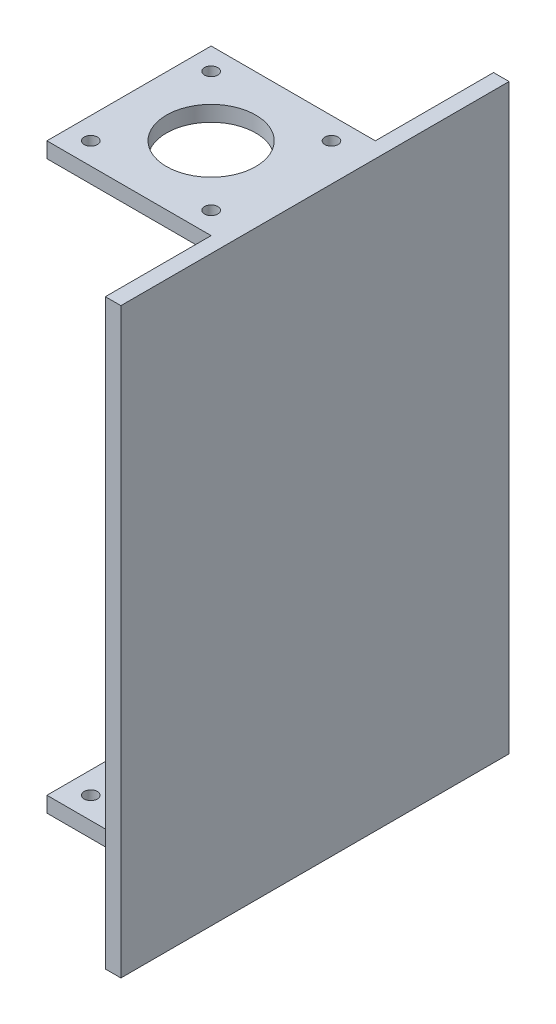
ISO-10303-21;
HEADER;
FILE_DESCRIPTION(('STEP AP214'),'2;1');
FILE_NAME('part.step','',(''),(''),'','','');
FILE_SCHEMA(('AUTOMOTIVE_DESIGN { 1 0 10303 214 1 1 1 1 }'));
ENDSEC;
DATA;
#1=APPLICATION_CONTEXT('core data for automotive mechanical design processes');
#2=APPLICATION_PROTOCOL_DEFINITION('international standard','automotive_design',2000,#1);
#3=PRODUCT_CONTEXT('',#1,'mechanical');
#4=PRODUCT('Part','Part','',(#3));
#5=PRODUCT_RELATED_PRODUCT_CATEGORY('part','',(#4));
#6=PRODUCT_DEFINITION_FORMATION('','',#4);
#7=PRODUCT_DEFINITION_CONTEXT('part definition',#1,'design');
#8=PRODUCT_DEFINITION('design','',#6,#7);
#9=PRODUCT_DEFINITION_SHAPE('','',#8);
#10=(LENGTH_UNIT() NAMED_UNIT(*) SI_UNIT(.MILLI.,.METRE.));
#11=(NAMED_UNIT(*) PLANE_ANGLE_UNIT() SI_UNIT($,.RADIAN.));
#12=(NAMED_UNIT(*) SI_UNIT($,.STERADIAN.) SOLID_ANGLE_UNIT());
#13=UNCERTAINTY_MEASURE_WITH_UNIT(LENGTH_MEASURE(1.E-05),#10,'distance_accuracy_value','');
#14=(GEOMETRIC_REPRESENTATION_CONTEXT(3) GLOBAL_UNCERTAINTY_ASSIGNED_CONTEXT((#13)) GLOBAL_UNIT_ASSIGNED_CONTEXT((#10,
#11,#12)) REPRESENTATION_CONTEXT('',''));
#15=CARTESIAN_POINT('',(0.,0.,0.));
#16=DIRECTION('',(0.,0.,1.));
#17=DIRECTION('',(1.,0.,0.));
#18=AXIS2_PLACEMENT_3D('',#15,#16,#17);
#19=CARTESIAN_POINT('',(21.15,0.,0.));
#20=DIRECTION('',(1.,0.,0.));
#21=DIRECTION('',(0.,0.,-1.));
#22=AXIS2_PLACEMENT_3D('',#19,#20,#21);
#23=PLANE('',#22);
#24=DIRECTION('',(0.,1.,0.));
#25=VECTOR('',#24,1.);
#26=CARTESIAN_POINT('',(21.15,-146.,21.15));
#27=LINE('',#26,#25);
#28=CARTESIAN_POINT('',(21.15,-146.,21.15));
#29=VERTEX_POINT('',#28);
#30=CARTESIAN_POINT('',(21.15,-142.,21.15));
#31=VERTEX_POINT('',#30);
#32=EDGE_CURVE('E143',#29,#31,#27,.T.);
#33=ORIENTED_EDGE('',*,*,#32,.F.);
#34=DIRECTION('',(0.,0.,-1.));
#35=VECTOR('',#34,1.);
#36=CARTESIAN_POINT('',(21.15,-146.,48.3941402757908));
#37=LINE('',#36,#35);
#38=CARTESIAN_POINT('',(21.15,-146.,48.3941402757908));
#39=VERTEX_POINT('',#38);
#40=EDGE_CURVE('E159',#39,#29,#37,.T.);
#41=ORIENTED_EDGE('',*,*,#40,.F.);
#42=DIRECTION('',(0.,-1.,0.));
#43=VECTOR('',#42,1.);
#44=CARTESIAN_POINT('',(21.15,4.,48.3941402757908));
#45=LINE('',#44,#43);
#46=CARTESIAN_POINT('',(21.15,4.,48.3941402757908));
#47=VERTEX_POINT('',#46);
#48=EDGE_CURVE('E163',#47,#39,#45,.T.);
#49=ORIENTED_EDGE('',*,*,#48,.F.);
#50=DIRECTION('',(0.,0.,1.));
#51=VECTOR('',#50,1.);
#52=CARTESIAN_POINT('',(21.15,4.,48.3941402757908));
#53=LINE('',#52,#51);
#54=CARTESIAN_POINT('',(21.15,4.,21.15));
#55=VERTEX_POINT('',#54);
#56=EDGE_CURVE('E171',#55,#47,#53,.T.);
#57=ORIENTED_EDGE('',*,*,#56,.F.);
#58=DIRECTION('',(0.,-1.,0.));
#59=VECTOR('',#58,1.);
#60=CARTESIAN_POINT('',(21.15,4.,21.15));
#61=LINE('',#60,#59);
#62=CARTESIAN_POINT('',(21.15,0.,21.15));
#63=VERTEX_POINT('',#62);
#64=EDGE_CURVE('E227',#55,#63,#61,.T.);
#65=ORIENTED_EDGE('',*,*,#64,.T.);
#66=DIRECTION('',(0.,0.,-1.));
#67=VECTOR('',#66,1.);
#68=CARTESIAN_POINT('',(21.15,0.,21.15));
#69=LINE('',#68,#67);
#70=CARTESIAN_POINT('',(21.15,0.,-21.15));
#71=VERTEX_POINT('',#70);
#72=EDGE_CURVE('E218',#63,#71,#69,.T.);
#73=ORIENTED_EDGE('',*,*,#72,.T.);
#74=DIRECTION('',(0.,-1.,0.));
#75=VECTOR('',#74,1.);
#76=CARTESIAN_POINT('',(21.15,4.,-21.15));
#77=LINE('',#76,#75);
#78=CARTESIAN_POINT('',(21.15,4.,-21.15));
#79=VERTEX_POINT('',#78);
#80=EDGE_CURVE('E11',#79,#71,#77,.T.);
#81=ORIENTED_EDGE('',*,*,#80,.F.);
#82=CARTESIAN_POINT('',(21.15,4.,-51.6058597242092));
#83=VERTEX_POINT('',#82);
#84=EDGE_CURVE('E176',#83,#79,#53,.T.);
#85=ORIENTED_EDGE('',*,*,#84,.F.);
#86=DIRECTION('',(0.,1.,0.));
#87=VECTOR('',#86,1.);
#88=CARTESIAN_POINT('',(21.15,4.,-51.6058597242092));
#89=LINE('',#88,#87);
#90=CARTESIAN_POINT('',(21.15,-146.,-51.6058597242092));
#91=VERTEX_POINT('',#90);
#92=EDGE_CURVE('E166',#91,#83,#89,.T.);
#93=ORIENTED_EDGE('',*,*,#92,.F.);
#94=CARTESIAN_POINT('',(21.15,-146.,-21.15));
#95=VERTEX_POINT('',#94);
#96=EDGE_CURVE('E169',#95,#91,#37,.T.);
#97=ORIENTED_EDGE('',*,*,#96,.F.);
#98=DIRECTION('',(0.,1.,0.));
#99=VECTOR('',#98,1.);
#100=CARTESIAN_POINT('',(21.15,-146.,-21.15));
#101=LINE('',#100,#99);
#102=CARTESIAN_POINT('',(21.15,-142.,-21.15));
#103=VERTEX_POINT('',#102);
#104=EDGE_CURVE('E473',#95,#103,#101,.T.);
#105=ORIENTED_EDGE('',*,*,#104,.T.);
#106=DIRECTION('',(0.,0.,-1.));
#107=VECTOR('',#106,1.);
#108=CARTESIAN_POINT('',(21.15,-142.,21.15));
#109=LINE('',#108,#107);
#110=EDGE_CURVE('E158',#31,#103,#109,.T.);
#111=ORIENTED_EDGE('',*,*,#110,.F.);
#112=EDGE_LOOP('',(#33,#41,#49,#57,#65,#73,#81,#85,#93,#97,#105,#111));
#113=FACE_BOUND('',#112,.T.);
#114=ADVANCED_FACE('F43',(#113),#23,.F.);
#115=CARTESIAN_POINT('',(0.,4.,0.));
#116=DIRECTION('',(0.,-1.,0.));
#117=DIRECTION('',(0.,0.,-1.));
#118=AXIS2_PLACEMENT_3D('',#115,#116,#117);
#119=PLANE('',#118);
#120=DIRECTION('',(1.,0.,0.));
#121=VECTOR('',#120,1.);
#122=CARTESIAN_POINT('',(-21.15,4.,21.15));
#123=LINE('',#122,#121);
#124=CARTESIAN_POINT('',(-21.15,4.,21.15));
#125=VERTEX_POINT('',#124);
#126=EDGE_CURVE('E66',#125,#55,#123,.T.);
#127=ORIENTED_EDGE('',*,*,#126,.T.);
#128=ORIENTED_EDGE('',*,*,#56,.T.);
#129=DIRECTION('',(-1.,0.,0.));
#130=VECTOR('',#129,1.);
#131=CARTESIAN_POINT('',(25.15,4.,48.3941402757908));
#132=LINE('',#131,#130);
#133=CARTESIAN_POINT('',(25.15,4.,48.3941402757908));
#134=VERTEX_POINT('',#133);
#135=EDGE_CURVE('E179',#134,#47,#132,.T.);
#136=ORIENTED_EDGE('',*,*,#135,.F.);
#137=DIRECTION('',(0.,0.,1.));
#138=VECTOR('',#137,1.);
#139=CARTESIAN_POINT('',(25.15,4.,48.3941402757908));
#140=LINE('',#139,#138);
#141=CARTESIAN_POINT('',(25.15,4.,-51.6058597242092));
#142=VERTEX_POINT('',#141);
#143=EDGE_CURVE('E183',#142,#134,#140,.T.);
#144=ORIENTED_EDGE('',*,*,#143,.F.);
#145=DIRECTION('',(-1.,0.,0.));
#146=VECTOR('',#145,1.);
#147=CARTESIAN_POINT('',(25.15,4.,-51.6058597242092));
#148=LINE('',#147,#146);
#149=EDGE_CURVE('E182',#142,#83,#148,.T.);
#150=ORIENTED_EDGE('',*,*,#149,.T.);
#151=ORIENTED_EDGE('',*,*,#84,.T.);
#152=DIRECTION('',(-1.,0.,0.));
#153=VECTOR('',#152,1.);
#154=CARTESIAN_POINT('',(-21.15,4.,-21.15));
#155=LINE('',#154,#153);
#156=CARTESIAN_POINT('',(-21.15,4.,-21.15));
#157=VERTEX_POINT('',#156);
#158=EDGE_CURVE('E95',#79,#157,#155,.T.);
#159=ORIENTED_EDGE('',*,*,#158,.T.);
#160=DIRECTION('',(0.,0.,1.));
#161=VECTOR('',#160,1.);
#162=CARTESIAN_POINT('',(-21.15,4.,21.15));
#163=LINE('',#162,#161);
#164=EDGE_CURVE('E225',#157,#125,#163,.T.);
#165=ORIENTED_EDGE('',*,*,#164,.T.);
#166=EDGE_LOOP('',(#127,#128,#136,#144,#150,#151,#159,#165));
#167=FACE_BOUND('',#166,.T.);
#168=CARTESIAN_POINT('',(-15.5,4.,-15.5));
#169=DIRECTION('',(0.,1.,0.));
#170=DIRECTION('',(0.,0.,1.));
#171=AXIS2_PLACEMENT_3D('',#168,#169,#170);
#172=CIRCLE('',#171,1.7);
#173=CARTESIAN_POINT('',(-15.5,4.,-13.8));
#174=VERTEX_POINT('',#173);
#175=EDGE_CURVE('E219',#174,#174,#172,.T.);
#176=ORIENTED_EDGE('',*,*,#175,.F.);
#177=EDGE_LOOP('',(#176));
#178=FACE_BOUND('',#177,.T.);
#179=CARTESIAN_POINT('',(15.5,4.,-15.5));
#180=DIRECTION('',(0.,1.,0.));
#181=DIRECTION('',(0.,0.,1.));
#182=AXIS2_PLACEMENT_3D('',#179,#180,#181);
#183=CIRCLE('',#182,1.7);
#184=CARTESIAN_POINT('',(15.5,4.,-13.8));
#185=VERTEX_POINT('',#184);
#186=EDGE_CURVE('E208',#185,#185,#183,.T.);
#187=ORIENTED_EDGE('',*,*,#186,.F.);
#188=EDGE_LOOP('',(#187));
#189=FACE_BOUND('',#188,.T.);
#190=CARTESIAN_POINT('',(15.5,4.,15.5));
#191=DIRECTION('',(0.,1.,0.));
#192=DIRECTION('',(0.,0.,1.));
#193=AXIS2_PLACEMENT_3D('',#190,#191,#192);
#194=CIRCLE('',#193,1.7);
#195=CARTESIAN_POINT('',(15.5,4.,17.2));
#196=VERTEX_POINT('',#195);
#197=EDGE_CURVE('E201',#196,#196,#194,.T.);
#198=ORIENTED_EDGE('',*,*,#197,.F.);
#199=EDGE_LOOP('',(#198));
#200=FACE_BOUND('',#199,.T.);
#201=CARTESIAN_POINT('',(-15.5,4.,15.5));
#202=DIRECTION('',(0.,1.,0.));
#203=DIRECTION('',(0.,0.,1.));
#204=AXIS2_PLACEMENT_3D('',#201,#202,#203);
#205=CIRCLE('',#204,1.7);
#206=CARTESIAN_POINT('',(-15.5,4.,17.2));
#207=VERTEX_POINT('',#206);
#208=EDGE_CURVE('E200',#207,#207,#205,.T.);
#209=ORIENTED_EDGE('',*,*,#208,.F.);
#210=EDGE_LOOP('',(#209));
#211=FACE_BOUND('',#210,.T.);
#212=CARTESIAN_POINT('',(0.,4.,0.));
#213=DIRECTION('',(0.,1.,0.));
#214=DIRECTION('',(0.,0.,1.));
#215=AXIS2_PLACEMENT_3D('',#212,#213,#214);
#216=CIRCLE('',#215,11.5);
#217=CARTESIAN_POINT('',(0.,4.,11.5));
#218=VERTEX_POINT('',#217);
#219=EDGE_CURVE('E195',#218,#218,#216,.T.);
#220=ORIENTED_EDGE('',*,*,#219,.F.);
#221=EDGE_LOOP('',(#220));
#222=FACE_BOUND('',#221,.T.);
#223=ADVANCED_FACE('F247',(#167,#178,#189,#200,#211,#222),#119,.F.);
#224=CARTESIAN_POINT('',(0.,0.,0.));
#225=DIRECTION('',(0.,-1.,0.));
#226=DIRECTION('',(0.,0.,-1.));
#227=AXIS2_PLACEMENT_3D('',#224,#225,#226);
#228=PLANE('',#227);
#229=CARTESIAN_POINT('',(-15.5,0.,15.5));
#230=DIRECTION('',(0.,1.,0.));
#231=DIRECTION('',(0.,0.,1.));
#232=AXIS2_PLACEMENT_3D('',#229,#230,#231);
#233=CIRCLE('',#232,1.7);
#234=CARTESIAN_POINT('',(-15.5,0.,17.2));
#235=VERTEX_POINT('',#234);
#236=EDGE_CURVE('E193',#235,#235,#233,.T.);
#237=ORIENTED_EDGE('',*,*,#236,.T.);
#238=EDGE_LOOP('',(#237));
#239=FACE_BOUND('',#238,.T.);
#240=CARTESIAN_POINT('',(15.5,0.,-15.5));
#241=DIRECTION('',(0.,1.,0.));
#242=DIRECTION('',(0.,0.,1.));
#243=AXIS2_PLACEMENT_3D('',#240,#241,#242);
#244=CIRCLE('',#243,1.7);
#245=CARTESIAN_POINT('',(15.5,0.,-13.8));
#246=VERTEX_POINT('',#245);
#247=EDGE_CURVE('E210',#246,#246,#244,.T.);
#248=ORIENTED_EDGE('',*,*,#247,.T.);
#249=EDGE_LOOP('',(#248));
#250=FACE_BOUND('',#249,.T.);
#251=ORIENTED_EDGE('',*,*,#72,.F.);
#252=DIRECTION('',(1.,0.,0.));
#253=VECTOR('',#252,1.);
#254=CARTESIAN_POINT('',(-21.15,0.,21.15));
#255=LINE('',#254,#253);
#256=CARTESIAN_POINT('',(-21.15,0.,21.15));
#257=VERTEX_POINT('',#256);
#258=EDGE_CURVE('E221',#257,#63,#255,.T.);
#259=ORIENTED_EDGE('',*,*,#258,.F.);
#260=DIRECTION('',(0.,0.,1.));
#261=VECTOR('',#260,1.);
#262=CARTESIAN_POINT('',(-21.15,0.,21.15));
#263=LINE('',#262,#261);
#264=CARTESIAN_POINT('',(-21.15,0.,-21.15));
#265=VERTEX_POINT('',#264);
#266=EDGE_CURVE('E89',#265,#257,#263,.T.);
#267=ORIENTED_EDGE('',*,*,#266,.F.);
#268=DIRECTION('',(-1.,0.,0.));
#269=VECTOR('',#268,1.);
#270=CARTESIAN_POINT('',(-21.15,0.,-21.15));
#271=LINE('',#270,#269);
#272=EDGE_CURVE('E229',#71,#265,#271,.T.);
#273=ORIENTED_EDGE('',*,*,#272,.F.);
#274=EDGE_LOOP('',(#251,#259,#267,#273));
#275=FACE_BOUND('',#274,.T.);
#276=CARTESIAN_POINT('',(-15.5,0.,-15.5));
#277=DIRECTION('',(0.,1.,0.));
#278=DIRECTION('',(0.,0.,1.));
#279=AXIS2_PLACEMENT_3D('',#276,#277,#278);
#280=CIRCLE('',#279,1.7);
#281=CARTESIAN_POINT('',(-15.5,0.,-13.8));
#282=VERTEX_POINT('',#281);
#283=EDGE_CURVE('E214',#282,#282,#280,.T.);
#284=ORIENTED_EDGE('',*,*,#283,.T.);
#285=EDGE_LOOP('',(#284));
#286=FACE_BOUND('',#285,.T.);
#287=CARTESIAN_POINT('',(15.5,0.,15.5));
#288=DIRECTION('',(0.,1.,0.));
#289=DIRECTION('',(0.,0.,1.));
#290=AXIS2_PLACEMENT_3D('',#287,#288,#289);
#291=CIRCLE('',#290,1.7);
#292=CARTESIAN_POINT('',(15.5,0.,17.2));
#293=VERTEX_POINT('',#292);
#294=EDGE_CURVE('E202',#293,#293,#291,.T.);
#295=ORIENTED_EDGE('',*,*,#294,.T.);
#296=EDGE_LOOP('',(#295));
#297=FACE_BOUND('',#296,.T.);
#298=CARTESIAN_POINT('',(0.,0.,0.));
#299=DIRECTION('',(0.,1.,0.));
#300=DIRECTION('',(0.,0.,1.));
#301=AXIS2_PLACEMENT_3D('',#298,#299,#300);
#302=CIRCLE('',#301,11.5);
#303=CARTESIAN_POINT('',(0.,0.,11.5));
#304=VERTEX_POINT('',#303);
#305=EDGE_CURVE('E192',#304,#304,#302,.T.);
#306=ORIENTED_EDGE('',*,*,#305,.T.);
#307=EDGE_LOOP('',(#306));
#308=FACE_BOUND('',#307,.T.);
#309=ADVANCED_FACE('F245',(#239,#250,#275,#286,#297,#308),#228,.T.);
#310=CARTESIAN_POINT('',(-21.15,4.,-21.15));
#311=DIRECTION('',(0.,0.,1.));
#312=DIRECTION('',(1.,0.,0.));
#313=AXIS2_PLACEMENT_3D('',#310,#311,#312);
#314=PLANE('',#313);
#315=ORIENTED_EDGE('',*,*,#272,.T.);
#316=DIRECTION('',(0.,-1.,0.));
#317=VECTOR('',#316,1.);
#318=CARTESIAN_POINT('',(-21.15,4.,-21.15));
#319=LINE('',#318,#317);
#320=EDGE_CURVE('E51',#157,#265,#319,.T.);
#321=ORIENTED_EDGE('',*,*,#320,.F.);
#322=ORIENTED_EDGE('',*,*,#158,.F.);
#323=ORIENTED_EDGE('',*,*,#80,.T.);
#324=EDGE_LOOP('',(#315,#321,#322,#323));
#325=FACE_BOUND('',#324,.T.);
#326=ADVANCED_FACE('F44',(#325),#314,.F.);
#327=CARTESIAN_POINT('',(-21.15,4.,21.15));
#328=DIRECTION('',(1.,0.,0.));
#329=DIRECTION('',(0.,0.,-1.));
#330=AXIS2_PLACEMENT_3D('',#327,#328,#329);
#331=PLANE('',#330);
#332=ORIENTED_EDGE('',*,*,#266,.T.);
#333=DIRECTION('',(0.,-1.,0.));
#334=VECTOR('',#333,1.);
#335=CARTESIAN_POINT('',(-21.15,4.,21.15));
#336=LINE('',#335,#334);
#337=EDGE_CURVE('E240',#125,#257,#336,.T.);
#338=ORIENTED_EDGE('',*,*,#337,.F.);
#339=ORIENTED_EDGE('',*,*,#164,.F.);
#340=ORIENTED_EDGE('',*,*,#320,.T.);
#341=EDGE_LOOP('',(#332,#338,#339,#340));
#342=FACE_BOUND('',#341,.T.);
#343=ADVANCED_FACE('F237',(#342),#331,.F.);
#344=CARTESIAN_POINT('',(-21.15,4.,21.15));
#345=DIRECTION('',(0.,0.,-1.));
#346=DIRECTION('',(-1.,0.,0.));
#347=AXIS2_PLACEMENT_3D('',#344,#345,#346);
#348=PLANE('',#347);
#349=ORIENTED_EDGE('',*,*,#258,.T.);
#350=ORIENTED_EDGE('',*,*,#64,.F.);
#351=ORIENTED_EDGE('',*,*,#126,.F.);
#352=ORIENTED_EDGE('',*,*,#337,.T.);
#353=EDGE_LOOP('',(#349,#350,#351,#352));
#354=FACE_BOUND('',#353,.T.);
#355=ADVANCED_FACE('F244',(#354),#348,.F.);
#356=CARTESIAN_POINT('',(-15.5,4.,-15.5));
#357=DIRECTION('',(0.,-1.,0.));
#358=DIRECTION('',(0.,0.,-1.));
#359=AXIS2_PLACEMENT_3D('',#356,#357,#358);
#360=CYLINDRICAL_SURFACE('',#359,1.7);
#361=ORIENTED_EDGE('',*,*,#175,.T.);
#362=EDGE_LOOP('',(#361));
#363=FACE_BOUND('',#362,.T.);
#364=ORIENTED_EDGE('',*,*,#283,.F.);
#365=EDGE_LOOP('',(#364));
#366=FACE_BOUND('',#365,.T.);
#367=ADVANCED_FACE('F307',(#363,#366),#360,.F.);
#368=CARTESIAN_POINT('',(15.5,4.,-15.5));
#369=DIRECTION('',(0.,-1.,0.));
#370=DIRECTION('',(0.,0.,-1.));
#371=AXIS2_PLACEMENT_3D('',#368,#369,#370);
#372=CYLINDRICAL_SURFACE('',#371,1.7);
#373=ORIENTED_EDGE('',*,*,#186,.T.);
#374=EDGE_LOOP('',(#373));
#375=FACE_BOUND('',#374,.T.);
#376=ORIENTED_EDGE('',*,*,#247,.F.);
#377=EDGE_LOOP('',(#376));
#378=FACE_BOUND('',#377,.T.);
#379=ADVANCED_FACE('F304',(#375,#378),#372,.F.);
#380=CARTESIAN_POINT('',(15.5,4.,15.5));
#381=DIRECTION('',(0.,-1.,0.));
#382=DIRECTION('',(0.,0.,-1.));
#383=AXIS2_PLACEMENT_3D('',#380,#381,#382);
#384=CYLINDRICAL_SURFACE('',#383,1.7);
#385=ORIENTED_EDGE('',*,*,#197,.T.);
#386=EDGE_LOOP('',(#385));
#387=FACE_BOUND('',#386,.T.);
#388=ORIENTED_EDGE('',*,*,#294,.F.);
#389=EDGE_LOOP('',(#388));
#390=FACE_BOUND('',#389,.T.);
#391=ADVANCED_FACE('F301',(#387,#390),#384,.F.);
#392=CARTESIAN_POINT('',(-15.5,4.,15.5));
#393=DIRECTION('',(0.,-1.,0.));
#394=DIRECTION('',(0.,0.,-1.));
#395=AXIS2_PLACEMENT_3D('',#392,#393,#394);
#396=CYLINDRICAL_SURFACE('',#395,1.7);
#397=ORIENTED_EDGE('',*,*,#208,.T.);
#398=EDGE_LOOP('',(#397));
#399=FACE_BOUND('',#398,.T.);
#400=ORIENTED_EDGE('',*,*,#236,.F.);
#401=EDGE_LOOP('',(#400));
#402=FACE_BOUND('',#401,.T.);
#403=ADVANCED_FACE('F300',(#399,#402),#396,.F.);
#404=CARTESIAN_POINT('',(0.,4.,0.));
#405=DIRECTION('',(0.,-1.,0.));
#406=DIRECTION('',(0.,0.,-1.));
#407=AXIS2_PLACEMENT_3D('',#404,#405,#406);
#408=CYLINDRICAL_SURFACE('',#407,11.5);
#409=ORIENTED_EDGE('',*,*,#219,.T.);
#410=EDGE_LOOP('',(#409));
#411=FACE_BOUND('',#410,.T.);
#412=ORIENTED_EDGE('',*,*,#305,.F.);
#413=EDGE_LOOP('',(#412));
#414=FACE_BOUND('',#413,.T.);
#415=ADVANCED_FACE('F295',(#411,#414),#408,.F.);
#416=CARTESIAN_POINT('',(25.15,4.,48.3941402757908));
#417=DIRECTION('',(0.,0.,-1.));
#418=DIRECTION('',(0.,1.,0.));
#419=AXIS2_PLACEMENT_3D('',#416,#417,#418);
#420=PLANE('',#419);
#421=ORIENTED_EDGE('',*,*,#48,.T.);
#422=DIRECTION('',(-1.,0.,0.));
#423=VECTOR('',#422,1.);
#424=CARTESIAN_POINT('',(25.15,-146.,48.3941402757908));
#425=LINE('',#424,#423);
#426=CARTESIAN_POINT('',(25.15,-146.,48.3941402757908));
#427=VERTEX_POINT('',#426);
#428=EDGE_CURVE('E168',#427,#39,#425,.T.);
#429=ORIENTED_EDGE('',*,*,#428,.F.);
#430=DIRECTION('',(0.,-1.,0.));
#431=VECTOR('',#430,1.);
#432=CARTESIAN_POINT('',(25.15,4.,48.3941402757908));
#433=LINE('',#432,#431);
#434=EDGE_CURVE('E177',#134,#427,#433,.T.);
#435=ORIENTED_EDGE('',*,*,#434,.F.);
#436=ORIENTED_EDGE('',*,*,#135,.T.);
#437=EDGE_LOOP('',(#421,#429,#435,#436));
#438=FACE_BOUND('',#437,.T.);
#439=ADVANCED_FACE('F254',(#438),#420,.F.);
#440=CARTESIAN_POINT('',(25.15,-146.,48.3941402757908));
#441=DIRECTION('',(0.,1.,0.));
#442=DIRECTION('',(0.,0.,1.));
#443=AXIS2_PLACEMENT_3D('',#440,#441,#442);
#444=PLANE('',#443);
#445=ORIENTED_EDGE('',*,*,#40,.T.);
#446=DIRECTION('',(1.,0.,0.));
#447=VECTOR('',#446,1.);
#448=CARTESIAN_POINT('',(-21.15,-146.,21.15));
#449=LINE('',#448,#447);
#450=CARTESIAN_POINT('',(-21.15,-146.,21.15));
#451=VERTEX_POINT('',#450);
#452=EDGE_CURVE('E145',#451,#29,#449,.T.);
#453=ORIENTED_EDGE('',*,*,#452,.F.);
#454=DIRECTION('',(0.,0.,1.));
#455=VECTOR('',#454,1.);
#456=CARTESIAN_POINT('',(-21.15,-146.,21.15));
#457=LINE('',#456,#455);
#458=CARTESIAN_POINT('',(-21.15,-146.,-21.15));
#459=VERTEX_POINT('',#458);
#460=EDGE_CURVE('E151',#459,#451,#457,.T.);
#461=ORIENTED_EDGE('',*,*,#460,.F.);
#462=DIRECTION('',(-1.,0.,0.));
#463=VECTOR('',#462,1.);
#464=CARTESIAN_POINT('',(-21.15,-146.,-21.15));
#465=LINE('',#464,#463);
#466=EDGE_CURVE('E475',#95,#459,#465,.T.);
#467=ORIENTED_EDGE('',*,*,#466,.F.);
#468=ORIENTED_EDGE('',*,*,#96,.T.);
#469=DIRECTION('',(-1.,0.,0.));
#470=VECTOR('',#469,1.);
#471=CARTESIAN_POINT('',(25.15,-146.,-51.6058597242092));
#472=LINE('',#471,#470);
#473=CARTESIAN_POINT('',(25.15,-146.,-51.6058597242092));
#474=VERTEX_POINT('',#473);
#475=EDGE_CURVE('E190',#474,#91,#472,.T.);
#476=ORIENTED_EDGE('',*,*,#475,.F.);
#477=DIRECTION('',(0.,0.,-1.));
#478=VECTOR('',#477,1.);
#479=CARTESIAN_POINT('',(25.15,-146.,48.3941402757908));
#480=LINE('',#479,#478);
#481=EDGE_CURVE('E257',#427,#474,#480,.T.);
#482=ORIENTED_EDGE('',*,*,#481,.F.);
#483=ORIENTED_EDGE('',*,*,#428,.T.);
#484=EDGE_LOOP('',(#445,#453,#461,#467,#468,#476,#482,#483));
#485=FACE_BOUND('',#484,.T.);
#486=CARTESIAN_POINT('',(0.,-146.,0.));
#487=DIRECTION('',(0.,1.,0.));
#488=DIRECTION('',(0.,0.,1.));
#489=AXIS2_PLACEMENT_3D('',#486,#487,#488);
#490=CIRCLE('',#489,11.5);
#491=CARTESIAN_POINT('',(0.,-146.,11.5));
#492=VERTEX_POINT('',#491);
#493=EDGE_CURVE('E439',#492,#492,#490,.T.);
#494=ORIENTED_EDGE('',*,*,#493,.T.);
#495=EDGE_LOOP('',(#494));
#496=FACE_BOUND('',#495,.T.);
#497=CARTESIAN_POINT('',(-15.5,-146.,15.5));
#498=DIRECTION('',(0.,1.,0.));
#499=DIRECTION('',(0.,0.,1.));
#500=AXIS2_PLACEMENT_3D('',#497,#498,#499);
#501=CIRCLE('',#500,1.7);
#502=CARTESIAN_POINT('',(-15.5,-146.,17.2));
#503=VERTEX_POINT('',#502);
#504=EDGE_CURVE('E449',#503,#503,#501,.T.);
#505=ORIENTED_EDGE('',*,*,#504,.T.);
#506=EDGE_LOOP('',(#505));
#507=FACE_BOUND('',#506,.T.);
#508=CARTESIAN_POINT('',(15.5,-146.,15.5));
#509=DIRECTION('',(0.,1.,0.));
#510=DIRECTION('',(0.,0.,1.));
#511=AXIS2_PLACEMENT_3D('',#508,#509,#510);
#512=CIRCLE('',#511,1.7);
#513=CARTESIAN_POINT('',(15.5,-146.,17.2));
#514=VERTEX_POINT('',#513);
#515=EDGE_CURVE('E451',#514,#514,#512,.T.);
#516=ORIENTED_EDGE('',*,*,#515,.T.);
#517=EDGE_LOOP('',(#516));
#518=FACE_BOUND('',#517,.T.);
#519=CARTESIAN_POINT('',(15.5,-146.,-15.5));
#520=DIRECTION('',(0.,1.,0.));
#521=DIRECTION('',(0.,0.,1.));
#522=AXIS2_PLACEMENT_3D('',#519,#520,#521);
#523=CIRCLE('',#522,1.7);
#524=CARTESIAN_POINT('',(15.5,-146.,-13.8));
#525=VERTEX_POINT('',#524);
#526=EDGE_CURVE('E457',#525,#525,#523,.T.);
#527=ORIENTED_EDGE('',*,*,#526,.T.);
#528=EDGE_LOOP('',(#527));
#529=FACE_BOUND('',#528,.T.);
#530=CARTESIAN_POINT('',(-15.5,-146.,-15.5));
#531=DIRECTION('',(0.,1.,0.));
#532=DIRECTION('',(0.,0.,1.));
#533=AXIS2_PLACEMENT_3D('',#530,#531,#532);
#534=CIRCLE('',#533,1.7);
#535=CARTESIAN_POINT('',(-15.5,-146.,-13.8));
#536=VERTEX_POINT('',#535);
#537=EDGE_CURVE('E467',#536,#536,#534,.T.);
#538=ORIENTED_EDGE('',*,*,#537,.T.);
#539=EDGE_LOOP('',(#538));
#540=FACE_BOUND('',#539,.T.);
#541=ADVANCED_FACE('F161',(#485,#496,#507,#518,#529,#540),#444,.F.);
#542=CARTESIAN_POINT('',(25.15,4.,-51.6058597242092));
#543=DIRECTION('',(0.,0.,1.));
#544=DIRECTION('',(0.,-1.,0.));
#545=AXIS2_PLACEMENT_3D('',#542,#543,#544);
#546=PLANE('',#545);
#547=ORIENTED_EDGE('',*,*,#92,.T.);
#548=ORIENTED_EDGE('',*,*,#149,.F.);
#549=DIRECTION('',(0.,1.,0.));
#550=VECTOR('',#549,1.);
#551=CARTESIAN_POINT('',(25.15,4.,-51.6058597242092));
#552=LINE('',#551,#550);
#553=EDGE_CURVE('E259',#474,#142,#552,.T.);
#554=ORIENTED_EDGE('',*,*,#553,.F.);
#555=ORIENTED_EDGE('',*,*,#475,.T.);
#556=EDGE_LOOP('',(#547,#548,#554,#555));
#557=FACE_BOUND('',#556,.T.);
#558=ADVANCED_FACE('F290',(#557),#546,.F.);
#559=CARTESIAN_POINT('',(25.15,0.,0.));
#560=DIRECTION('',(1.,0.,0.));
#561=DIRECTION('',(0.,0.,-1.));
#562=AXIS2_PLACEMENT_3D('',#559,#560,#561);
#563=PLANE('',#562);
#564=ORIENTED_EDGE('',*,*,#434,.T.);
#565=ORIENTED_EDGE('',*,*,#481,.T.);
#566=ORIENTED_EDGE('',*,*,#553,.T.);
#567=ORIENTED_EDGE('',*,*,#143,.T.);
#568=EDGE_LOOP('',(#564,#565,#566,#567));
#569=FACE_BOUND('',#568,.T.);
#570=ADVANCED_FACE('F261',(#569),#563,.T.);
#571=CARTESIAN_POINT('',(-21.15,-146.,21.15));
#572=DIRECTION('',(0.,0.,1.));
#573=DIRECTION('',(1.,0.,0.));
#574=AXIS2_PLACEMENT_3D('',#571,#572,#573);
#575=PLANE('',#574);
#576=DIRECTION('',(1.,0.,0.));
#577=VECTOR('',#576,1.);
#578=CARTESIAN_POINT('',(-21.15,-142.,21.15));
#579=LINE('',#578,#577);
#580=CARTESIAN_POINT('',(-21.15,-142.,21.15));
#581=VERTEX_POINT('',#580);
#582=EDGE_CURVE('E59',#581,#31,#579,.T.);
#583=ORIENTED_EDGE('',*,*,#582,.F.);
#584=DIRECTION('',(0.,1.,0.));
#585=VECTOR('',#584,1.);
#586=CARTESIAN_POINT('',(-21.15,-146.,21.15));
#587=LINE('',#586,#585);
#588=EDGE_CURVE('E150',#451,#581,#587,.T.);
#589=ORIENTED_EDGE('',*,*,#588,.F.);
#590=ORIENTED_EDGE('',*,*,#452,.T.);
#591=ORIENTED_EDGE('',*,*,#32,.T.);
#592=EDGE_LOOP('',(#583,#589,#590,#591));
#593=FACE_BOUND('',#592,.T.);
#594=ADVANCED_FACE('F144',(#593),#575,.T.);
#595=CARTESIAN_POINT('',(-21.15,-146.,21.15));
#596=DIRECTION('',(-1.,0.,0.));
#597=DIRECTION('',(0.,0.,1.));
#598=AXIS2_PLACEMENT_3D('',#595,#596,#597);
#599=PLANE('',#598);
#600=DIRECTION('',(0.,0.,1.));
#601=VECTOR('',#600,1.);
#602=CARTESIAN_POINT('',(-21.15,-142.,21.15));
#603=LINE('',#602,#601);
#604=CARTESIAN_POINT('',(-21.15,-142.,-21.15));
#605=VERTEX_POINT('',#604);
#606=EDGE_CURVE('E480',#605,#581,#603,.T.);
#607=ORIENTED_EDGE('',*,*,#606,.F.);
#608=DIRECTION('',(0.,1.,0.));
#609=VECTOR('',#608,1.);
#610=CARTESIAN_POINT('',(-21.15,-146.,-21.15));
#611=LINE('',#610,#609);
#612=EDGE_CURVE('E485',#459,#605,#611,.T.);
#613=ORIENTED_EDGE('',*,*,#612,.F.);
#614=ORIENTED_EDGE('',*,*,#460,.T.);
#615=ORIENTED_EDGE('',*,*,#588,.T.);
#616=EDGE_LOOP('',(#607,#613,#614,#615));
#617=FACE_BOUND('',#616,.T.);
#618=ADVANCED_FACE('F358',(#617),#599,.T.);
#619=CARTESIAN_POINT('',(-21.15,-146.,-21.15));
#620=DIRECTION('',(0.,0.,-1.));
#621=DIRECTION('',(-1.,0.,0.));
#622=AXIS2_PLACEMENT_3D('',#619,#620,#621);
#623=PLANE('',#622);
#624=DIRECTION('',(-1.,0.,0.));
#625=VECTOR('',#624,1.);
#626=CARTESIAN_POINT('',(-21.15,-142.,-21.15));
#627=LINE('',#626,#625);
#628=EDGE_CURVE('E155',#103,#605,#627,.T.);
#629=ORIENTED_EDGE('',*,*,#628,.F.);
#630=ORIENTED_EDGE('',*,*,#104,.F.);
#631=ORIENTED_EDGE('',*,*,#466,.T.);
#632=ORIENTED_EDGE('',*,*,#612,.T.);
#633=EDGE_LOOP('',(#629,#630,#631,#632));
#634=FACE_BOUND('',#633,.T.);
#635=ADVANCED_FACE('F364',(#634),#623,.T.);
#636=CARTESIAN_POINT('',(0.,-142.,0.));
#637=DIRECTION('',(0.,1.,0.));
#638=DIRECTION('',(0.,0.,-1.));
#639=AXIS2_PLACEMENT_3D('',#636,#637,#638);
#640=PLANE('',#639);
#641=CARTESIAN_POINT('',(0.,-142.,0.));
#642=DIRECTION('',(0.,1.,0.));
#643=DIRECTION('',(0.,0.,1.));
#644=AXIS2_PLACEMENT_3D('',#641,#642,#643);
#645=CIRCLE('',#644,11.5);
#646=CARTESIAN_POINT('',(0.,-142.,11.5));
#647=VERTEX_POINT('',#646);
#648=EDGE_CURVE('E442',#647,#647,#645,.T.);
#649=ORIENTED_EDGE('',*,*,#648,.F.);
#650=EDGE_LOOP('',(#649));
#651=FACE_BOUND('',#650,.T.);
#652=CARTESIAN_POINT('',(-15.5,-142.,15.5));
#653=DIRECTION('',(0.,1.,0.));
#654=DIRECTION('',(0.,0.,1.));
#655=AXIS2_PLACEMENT_3D('',#652,#653,#654);
#656=CIRCLE('',#655,1.7);
#657=CARTESIAN_POINT('',(-15.5,-142.,17.2));
#658=VERTEX_POINT('',#657);
#659=EDGE_CURVE('E444',#658,#658,#656,.T.);
#660=ORIENTED_EDGE('',*,*,#659,.F.);
#661=EDGE_LOOP('',(#660));
#662=FACE_BOUND('',#661,.T.);
#663=CARTESIAN_POINT('',(15.5,-142.,15.5));
#664=DIRECTION('',(0.,1.,0.));
#665=DIRECTION('',(0.,0.,1.));
#666=AXIS2_PLACEMENT_3D('',#663,#664,#665);
#667=CIRCLE('',#666,1.7);
#668=CARTESIAN_POINT('',(15.5,-142.,17.2));
#669=VERTEX_POINT('',#668);
#670=EDGE_CURVE('E452',#669,#669,#667,.T.);
#671=ORIENTED_EDGE('',*,*,#670,.F.);
#672=EDGE_LOOP('',(#671));
#673=FACE_BOUND('',#672,.T.);
#674=CARTESIAN_POINT('',(15.5,-142.,-15.5));
#675=DIRECTION('',(0.,1.,0.));
#676=DIRECTION('',(0.,0.,1.));
#677=AXIS2_PLACEMENT_3D('',#674,#675,#676);
#678=CIRCLE('',#677,1.7);
#679=CARTESIAN_POINT('',(15.5,-142.,-13.8));
#680=VERTEX_POINT('',#679);
#681=EDGE_CURVE('E456',#680,#680,#678,.T.);
#682=ORIENTED_EDGE('',*,*,#681,.F.);
#683=EDGE_LOOP('',(#682));
#684=FACE_BOUND('',#683,.T.);
#685=CARTESIAN_POINT('',(-15.5,-142.,-15.5));
#686=DIRECTION('',(0.,1.,0.));
#687=DIRECTION('',(0.,0.,1.));
#688=AXIS2_PLACEMENT_3D('',#685,#686,#687);
#689=CIRCLE('',#688,1.7);
#690=CARTESIAN_POINT('',(-15.5,-142.,-13.8));
#691=VERTEX_POINT('',#690);
#692=EDGE_CURVE('E465',#691,#691,#689,.T.);
#693=ORIENTED_EDGE('',*,*,#692,.F.);
#694=EDGE_LOOP('',(#693));
#695=FACE_BOUND('',#694,.T.);
#696=ORIENTED_EDGE('',*,*,#110,.T.);
#697=ORIENTED_EDGE('',*,*,#628,.T.);
#698=ORIENTED_EDGE('',*,*,#606,.T.);
#699=ORIENTED_EDGE('',*,*,#582,.T.);
#700=EDGE_LOOP('',(#696,#697,#698,#699));
#701=FACE_BOUND('',#700,.T.);
#702=ADVANCED_FACE('F372',(#651,#662,#673,#684,#695,#701),#640,.T.);
#703=CARTESIAN_POINT('',(-15.5,-146.,-15.5));
#704=DIRECTION('',(0.,1.,0.));
#705=DIRECTION('',(0.,0.,1.));
#706=AXIS2_PLACEMENT_3D('',#703,#704,#705);
#707=CYLINDRICAL_SURFACE('',#706,1.7);
#708=ORIENTED_EDGE('',*,*,#537,.F.);
#709=EDGE_LOOP('',(#708));
#710=FACE_BOUND('',#709,.T.);
#711=ORIENTED_EDGE('',*,*,#692,.T.);
#712=EDGE_LOOP('',(#711));
#713=FACE_BOUND('',#712,.T.);
#714=ADVANCED_FACE('F381',(#710,#713),#707,.F.);
#715=CARTESIAN_POINT('',(15.5,-146.,-15.5));
#716=DIRECTION('',(0.,1.,0.));
#717=DIRECTION('',(0.,0.,1.));
#718=AXIS2_PLACEMENT_3D('',#715,#716,#717);
#719=CYLINDRICAL_SURFACE('',#718,1.7);
#720=ORIENTED_EDGE('',*,*,#526,.F.);
#721=EDGE_LOOP('',(#720));
#722=FACE_BOUND('',#721,.T.);
#723=ORIENTED_EDGE('',*,*,#681,.T.);
#724=EDGE_LOOP('',(#723));
#725=FACE_BOUND('',#724,.T.);
#726=ADVANCED_FACE('F393',(#722,#725),#719,.F.);
#727=CARTESIAN_POINT('',(15.5,-146.,15.5));
#728=DIRECTION('',(0.,1.,0.));
#729=DIRECTION('',(0.,0.,1.));
#730=AXIS2_PLACEMENT_3D('',#727,#728,#729);
#731=CYLINDRICAL_SURFACE('',#730,1.7);
#732=ORIENTED_EDGE('',*,*,#515,.F.);
#733=EDGE_LOOP('',(#732));
#734=FACE_BOUND('',#733,.T.);
#735=ORIENTED_EDGE('',*,*,#670,.T.);
#736=EDGE_LOOP('',(#735));
#737=FACE_BOUND('',#736,.T.);
#738=ADVANCED_FACE('F404',(#734,#737),#731,.F.);
#739=CARTESIAN_POINT('',(-15.5,-146.,15.5));
#740=DIRECTION('',(0.,1.,0.));
#741=DIRECTION('',(0.,0.,1.));
#742=AXIS2_PLACEMENT_3D('',#739,#740,#741);
#743=CYLINDRICAL_SURFACE('',#742,1.7);
#744=ORIENTED_EDGE('',*,*,#504,.F.);
#745=EDGE_LOOP('',(#744));
#746=FACE_BOUND('',#745,.T.);
#747=ORIENTED_EDGE('',*,*,#659,.T.);
#748=EDGE_LOOP('',(#747));
#749=FACE_BOUND('',#748,.T.);
#750=ADVANCED_FACE('F413',(#746,#749),#743,.F.);
#751=CARTESIAN_POINT('',(0.,-146.,0.));
#752=DIRECTION('',(0.,1.,0.));
#753=DIRECTION('',(0.,0.,1.));
#754=AXIS2_PLACEMENT_3D('',#751,#752,#753);
#755=CYLINDRICAL_SURFACE('',#754,11.5);
#756=ORIENTED_EDGE('',*,*,#493,.F.);
#757=EDGE_LOOP('',(#756));
#758=FACE_BOUND('',#757,.T.);
#759=ORIENTED_EDGE('',*,*,#648,.T.);
#760=EDGE_LOOP('',(#759));
#761=FACE_BOUND('',#760,.T.);
#762=ADVANCED_FACE('F425',(#758,#761),#755,.F.);
#763=CLOSED_SHELL('',(#114,#223,#309,#326,#343,#355,#367,#379,#391,#403,#415,#439,#541,#558,
#570,#594,#618,#635,#702,#714,#726,#738,#750,#762));
#764=MANIFOLD_SOLID_BREP('B2',#763);
#765=ADVANCED_BREP_SHAPE_REPRESENTATION('',(#18,#764),#14);
#766=SHAPE_DEFINITION_REPRESENTATION(#9,#765);
ENDSEC;
END-ISO-10303-21;
